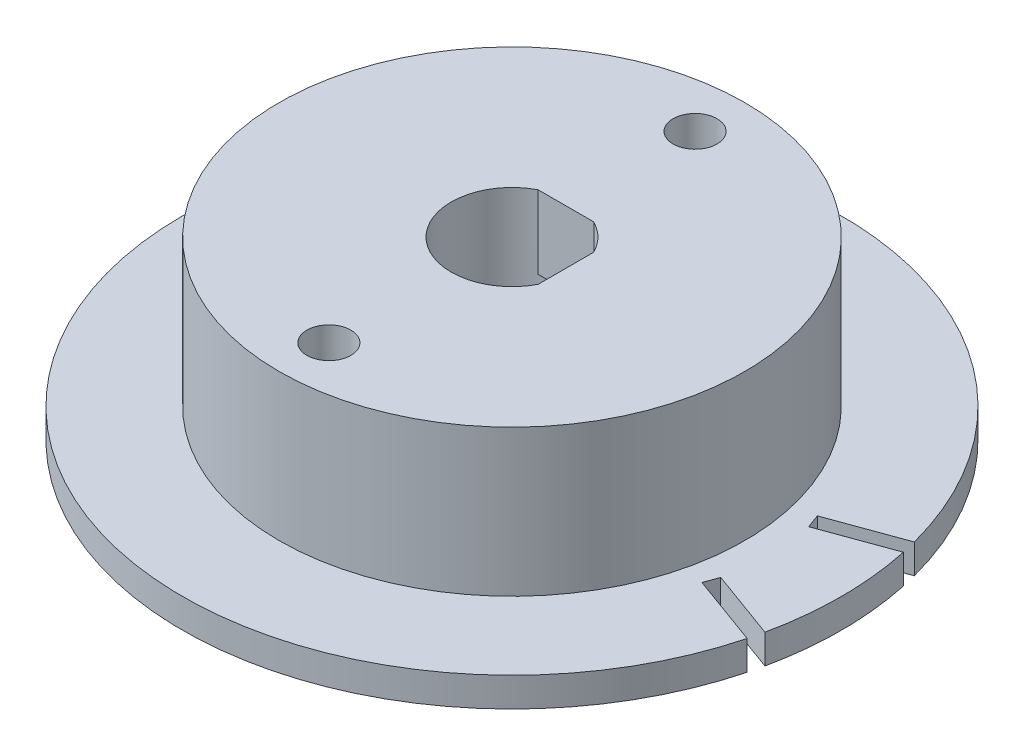
ISO-10303-21;
HEADER;
FILE_DESCRIPTION(('STEP AP214'),'2;1');
FILE_NAME('part.step','',(''),(''),'','','');
FILE_SCHEMA(('AUTOMOTIVE_DESIGN { 1 0 10303 214 1 1 1 1 }'));
ENDSEC;
DATA;
#1=APPLICATION_CONTEXT('core data for automotive mechanical design processes');
#2=APPLICATION_PROTOCOL_DEFINITION('international standard','automotive_design',2000,#1);
#3=PRODUCT_CONTEXT('',#1,'mechanical');
#4=PRODUCT('Part','Part','',(#3));
#5=PRODUCT_RELATED_PRODUCT_CATEGORY('part','',(#4));
#6=PRODUCT_DEFINITION_FORMATION('','',#4);
#7=PRODUCT_DEFINITION_CONTEXT('part definition',#1,'design');
#8=PRODUCT_DEFINITION('design','',#6,#7);
#9=PRODUCT_DEFINITION_SHAPE('','',#8);
#10=(LENGTH_UNIT() NAMED_UNIT(*) SI_UNIT(.MILLI.,.METRE.));
#11=(NAMED_UNIT(*) PLANE_ANGLE_UNIT() SI_UNIT($,.RADIAN.));
#12=(NAMED_UNIT(*) SI_UNIT($,.STERADIAN.) SOLID_ANGLE_UNIT());
#13=UNCERTAINTY_MEASURE_WITH_UNIT(LENGTH_MEASURE(1.E-05),#10,'distance_accuracy_value','');
#14=(GEOMETRIC_REPRESENTATION_CONTEXT(3) GLOBAL_UNCERTAINTY_ASSIGNED_CONTEXT((#13)) GLOBAL_UNIT_ASSIGNED_CONTEXT((#10,
#11,#12)) REPRESENTATION_CONTEXT('',''));
#15=CARTESIAN_POINT('',(0.,0.,0.));
#16=DIRECTION('',(0.,0.,1.));
#17=DIRECTION('',(1.,0.,0.));
#18=AXIS2_PLACEMENT_3D('',#15,#16,#17);
#19=CARTESIAN_POINT('',(0.,-2.,0.));
#20=DIRECTION('',(0.,1.,0.));
#21=DIRECTION('',(0.,0.,1.));
#22=AXIS2_PLACEMENT_3D('',#19,#20,#21);
#23=CYLINDRICAL_SURFACE('',#22,22.5);
#24=CARTESIAN_POINT('',(0.,0.,0.));
#25=DIRECTION('',(0.,-1.,0.));
#26=DIRECTION('',(0.,0.,-1.));
#27=AXIS2_PLACEMENT_3D('',#24,#25,#26);
#28=CIRCLE('',#27,22.5);
#29=CARTESIAN_POINT('',(21.9979445848756,0.,-4.72656683447342));
#30=VERTEX_POINT('',#29);
#31=CARTESIAN_POINT('',(21.9979445848755,0.,4.72656683447342));
#32=VERTEX_POINT('',#31);
#33=EDGE_CURVE('E217',#30,#32,#28,.T.);
#34=ORIENTED_EDGE('',*,*,#33,.T.);
#35=DIRECTION('',(0.,1.,0.));
#36=VECTOR('',#35,1.);
#37=CARTESIAN_POINT('',(21.9979445848755,-3.,4.72656683447342));
#38=LINE('',#37,#36);
#39=CARTESIAN_POINT('',(21.9979445848755,-2.,4.72656683447342));
#40=VERTEX_POINT('',#39);
#41=EDGE_CURVE('E178',#40,#32,#38,.T.);
#42=ORIENTED_EDGE('',*,*,#41,.F.);
#43=CARTESIAN_POINT('',(0.,-2.,0.));
#44=DIRECTION('',(0.,-1.,0.));
#45=DIRECTION('',(0.,0.,-1.));
#46=AXIS2_PLACEMENT_3D('',#43,#44,#45);
#47=CIRCLE('',#46,22.5);
#48=CARTESIAN_POINT('',(21.9979445848756,-2.,-4.72656683447342));
#49=VERTEX_POINT('',#48);
#50=EDGE_CURVE('E212',#49,#40,#47,.T.);
#51=ORIENTED_EDGE('',*,*,#50,.F.);
#52=DIRECTION('',(0.,1.,0.));
#53=VECTOR('',#52,1.);
#54=CARTESIAN_POINT('',(21.9979445848756,-3.,-4.72656683447342));
#55=LINE('',#54,#53);
#56=EDGE_CURVE('E190',#49,#30,#55,.T.);
#57=ORIENTED_EDGE('',*,*,#56,.T.);
#58=EDGE_LOOP('',(#34,#42,#51,#57));
#59=FACE_BOUND('',#58,.T.);
#60=ADVANCED_FACE('F31',(#59),#23,.T.);
#61=CARTESIAN_POINT('',(0.,10.,0.));
#62=DIRECTION('',(0.,-1.,0.));
#63=DIRECTION('',(0.,0.,-1.));
#64=AXIS2_PLACEMENT_3D('',#61,#62,#63);
#65=CYLINDRICAL_SURFACE('',#64,15.9);
#66=CARTESIAN_POINT('',(0.,10.,0.));
#67=DIRECTION('',(0.,1.,0.));
#68=DIRECTION('',(0.,0.,1.));
#69=AXIS2_PLACEMENT_3D('',#66,#67,#68);
#70=CIRCLE('',#69,15.9);
#71=CARTESIAN_POINT('',(0.,10.,15.9));
#72=VERTEX_POINT('',#71);
#73=EDGE_CURVE('E222',#72,#72,#70,.T.);
#74=ORIENTED_EDGE('',*,*,#73,.F.);
#75=EDGE_LOOP('',(#74));
#76=FACE_BOUND('',#75,.T.);
#77=CARTESIAN_POINT('',(0.,0.,0.));
#78=DIRECTION('',(0.,-1.,0.));
#79=DIRECTION('',(0.,0.,-1.));
#80=AXIS2_PLACEMENT_3D('',#77,#78,#79);
#81=CIRCLE('',#80,15.9);
#82=CARTESIAN_POINT('',(0.,0.,-15.9));
#83=VERTEX_POINT('',#82);
#84=EDGE_CURVE('E215',#83,#83,#81,.T.);
#85=ORIENTED_EDGE('',*,*,#84,.F.);
#86=EDGE_LOOP('',(#85));
#87=FACE_BOUND('',#86,.T.);
#88=ADVANCED_FACE('F257',(#76,#87),#65,.T.);
#89=CARTESIAN_POINT('',(0.,10.,0.));
#90=DIRECTION('',(0.,1.,0.));
#91=DIRECTION('',(0.,0.,1.));
#92=AXIS2_PLACEMENT_3D('',#89,#90,#91);
#93=PLANE('',#92);
#94=CARTESIAN_POINT('',(0.,10.,0.));
#95=DIRECTION('',(0.,1.,0.));
#96=DIRECTION('',(0.,0.,1.));
#97=AXIS2_PLACEMENT_3D('',#94,#95,#96);
#98=CIRCLE('',#97,4.15);
#99=CARTESIAN_POINT('',(-1.9,10.,-3.68951216287465));
#100=VERTEX_POINT('',#99);
#101=CARTESIAN_POINT('',(3.68951216287465,10.,1.9));
#102=VERTEX_POINT('',#101);
#103=EDGE_CURVE('E46',#100,#102,#98,.T.);
#104=ORIENTED_EDGE('',*,*,#103,.F.);
#105=DIRECTION('',(-1.,0.,0.));
#106=VECTOR('',#105,1.);
#107=CARTESIAN_POINT('',(1.9,10.,-3.68951216287465));
#108=LINE('',#107,#106);
#109=CARTESIAN_POINT('',(1.9,10.,-3.68951216287465));
#110=VERTEX_POINT('',#109);
#111=EDGE_CURVE('E139',#110,#100,#108,.T.);
#112=ORIENTED_EDGE('',*,*,#111,.F.);
#113=CARTESIAN_POINT('',(0.,10.,0.));
#114=DIRECTION('',(0.,1.,0.));
#115=DIRECTION('',(0.,0.,-1.));
#116=AXIS2_PLACEMENT_3D('',#113,#114,#115);
#117=CIRCLE('',#116,4.15);
#118=CARTESIAN_POINT('',(3.68951216287465,10.,-1.9));
#119=VERTEX_POINT('',#118);
#120=EDGE_CURVE('E167',#119,#110,#117,.T.);
#121=ORIENTED_EDGE('',*,*,#120,.F.);
#122=DIRECTION('',(0.,0.,-1.));
#123=VECTOR('',#122,1.);
#124=CARTESIAN_POINT('',(3.68951216287465,10.,-1.9));
#125=LINE('',#124,#123);
#126=EDGE_CURVE('E164',#102,#119,#125,.T.);
#127=ORIENTED_EDGE('',*,*,#126,.F.);
#128=EDGE_LOOP('',(#104,#112,#121,#127));
#129=FACE_BOUND('',#128,.T.);
#130=CARTESIAN_POINT('',(0.,10.,12.5));
#131=DIRECTION('',(0.,1.,0.));
#132=DIRECTION('',(0.,0.,1.));
#133=AXIS2_PLACEMENT_3D('',#130,#131,#132);
#134=CIRCLE('',#133,1.5);
#135=CARTESIAN_POINT('',(0.,10.,14.));
#136=VERTEX_POINT('',#135);
#137=EDGE_CURVE('E193',#136,#136,#134,.T.);
#138=ORIENTED_EDGE('',*,*,#137,.F.);
#139=EDGE_LOOP('',(#138));
#140=FACE_BOUND('',#139,.T.);
#141=CARTESIAN_POINT('',(0.,10.,-12.5));
#142=DIRECTION('',(0.,1.,0.));
#143=DIRECTION('',(0.,0.,1.));
#144=AXIS2_PLACEMENT_3D('',#141,#142,#143);
#145=CIRCLE('',#144,1.5);
#146=CARTESIAN_POINT('',(0.,10.,-11.));
#147=VERTEX_POINT('',#146);
#148=EDGE_CURVE('E203',#147,#147,#145,.T.);
#149=ORIENTED_EDGE('',*,*,#148,.F.);
#150=EDGE_LOOP('',(#149));
#151=FACE_BOUND('',#150,.T.);
#152=ORIENTED_EDGE('',*,*,#73,.T.);
#153=EDGE_LOOP('',(#152));
#154=FACE_BOUND('',#153,.T.);
#155=ADVANCED_FACE('F264',(#129,#140,#151,#154),#93,.T.);
#156=CARTESIAN_POINT('',(0.,0.,0.));
#157=DIRECTION('',(0.,-1.,0.));
#158=DIRECTION('',(0.,0.,-1.));
#159=AXIS2_PLACEMENT_3D('',#156,#157,#158);
#160=PLANE('',#159);
#161=DIRECTION('',(-0.342020143325669,0.,0.939692620785908));
#162=VECTOR('',#161,1.);
#163=CARTESIAN_POINT('',(16.9122210506549,0.,3.93969262078591));
#164=LINE('',#163,#162);
#165=CARTESIAN_POINT('',(17.2542411939806,0.,3.));
#166=VERTEX_POINT('',#165);
#167=CARTESIAN_POINT('',(16.9122210506549,0.,3.93969262078591));
#168=VERTEX_POINT('',#167);
#169=EDGE_CURVE('E140',#166,#168,#164,.T.);
#170=ORIENTED_EDGE('',*,*,#169,.F.);
#171=DIRECTION('',(-0.939692620785908,0.,-0.342020143325669));
#172=VECTOR('',#171,1.);
#173=CARTESIAN_POINT('',(17.2542411939806,0.,3.));
#174=LINE('',#173,#172);
#175=EDGE_CURVE('E171',#32,#166,#174,.T.);
#176=ORIENTED_EDGE('',*,*,#175,.F.);
#177=ORIENTED_EDGE('',*,*,#33,.F.);
#178=DIRECTION('',(0.939692620785908,0.,-0.342020143325669));
#179=VECTOR('',#178,1.);
#180=CARTESIAN_POINT('',(17.2542411939806,0.,-3.));
#181=LINE('',#180,#179);
#182=CARTESIAN_POINT('',(17.2542411939806,0.,-3.));
#183=VERTEX_POINT('',#182);
#184=EDGE_CURVE('E187',#183,#30,#181,.T.);
#185=ORIENTED_EDGE('',*,*,#184,.F.);
#186=DIRECTION('',(0.342020143325669,0.,0.939692620785908));
#187=VECTOR('',#186,1.);
#188=CARTESIAN_POINT('',(16.9122210506549,0.,-3.93969262078591));
#189=LINE('',#188,#187);
#190=CARTESIAN_POINT('',(16.9122210506549,0.,-3.93969262078591));
#191=VERTEX_POINT('',#190);
#192=EDGE_CURVE('E184',#191,#183,#189,.T.);
#193=ORIENTED_EDGE('',*,*,#192,.F.);
#194=DIRECTION('',(-0.939692620785908,0.,0.342020143325669));
#195=VECTOR('',#194,1.);
#196=CARTESIAN_POINT('',(21.7645134280647,0.,-5.70578261411984));
#197=LINE('',#196,#195);
#198=CARTESIAN_POINT('',(21.7645134280647,0.,-5.70578261411984));
#199=VERTEX_POINT('',#198);
#200=EDGE_CURVE('E177',#199,#191,#197,.T.);
#201=ORIENTED_EDGE('',*,*,#200,.F.);
#202=CARTESIAN_POINT('',(21.7645134280647,0.,5.70578261411984));
#203=VERTEX_POINT('',#202);
#204=EDGE_CURVE('E209',#203,#199,#28,.T.);
#205=ORIENTED_EDGE('',*,*,#204,.F.);
#206=DIRECTION('',(0.939692620785908,0.,0.342020143325669));
#207=VECTOR('',#206,1.);
#208=CARTESIAN_POINT('',(21.7645134280647,0.,5.70578261411984));
#209=LINE('',#208,#207);
#210=EDGE_CURVE('E143',#168,#203,#209,.T.);
#211=ORIENTED_EDGE('',*,*,#210,.F.);
#212=EDGE_LOOP('',(#170,#176,#177,#185,#193,#201,#205,#211));
#213=FACE_BOUND('',#212,.T.);
#214=ORIENTED_EDGE('',*,*,#84,.T.);
#215=EDGE_LOOP('',(#214));
#216=FACE_BOUND('',#215,.T.);
#217=ADVANCED_FACE('F270',(#213,#216),#160,.F.);
#218=CARTESIAN_POINT('',(21.7645134280647,-2.,5.70578261411984));
#219=VERTEX_POINT('',#218);
#220=CARTESIAN_POINT('',(21.7645134280647,-2.,-5.70578261411984));
#221=VERTEX_POINT('',#220);
#222=EDGE_CURVE('E216',#219,#221,#47,.T.);
#223=ORIENTED_EDGE('',*,*,#222,.F.);
#224=DIRECTION('',(0.,1.,0.));
#225=VECTOR('',#224,1.);
#226=CARTESIAN_POINT('',(21.7645134280647,-3.,5.70578261411984));
#227=LINE('',#226,#225);
#228=EDGE_CURVE('E54',#219,#203,#227,.T.);
#229=ORIENTED_EDGE('',*,*,#228,.T.);
#230=ORIENTED_EDGE('',*,*,#204,.T.);
#231=DIRECTION('',(0.,1.,0.));
#232=VECTOR('',#231,1.);
#233=CARTESIAN_POINT('',(21.7645134280647,-3.,-5.70578261411984));
#234=LINE('',#233,#232);
#235=EDGE_CURVE('E189',#221,#199,#234,.T.);
#236=ORIENTED_EDGE('',*,*,#235,.F.);
#237=EDGE_LOOP('',(#223,#229,#230,#236));
#238=FACE_BOUND('',#237,.T.);
#239=ADVANCED_FACE('F260',(#238),#23,.T.);
#240=CARTESIAN_POINT('',(0.,-2.,0.));
#241=DIRECTION('',(0.,-1.,0.));
#242=DIRECTION('',(0.,0.,-1.));
#243=AXIS2_PLACEMENT_3D('',#240,#241,#242);
#244=PLANE('',#243);
#245=CARTESIAN_POINT('',(0.,-2.,0.));
#246=DIRECTION('',(0.,-1.,0.));
#247=DIRECTION('',(0.,0.,-1.));
#248=AXIS2_PLACEMENT_3D('',#245,#246,#247);
#249=CIRCLE('',#248,5.15000000000002);
#250=CARTESIAN_POINT('',(0.,-2.,-5.15000000000002));
#251=VERTEX_POINT('',#250);
#252=EDGE_CURVE('E11',#251,#251,#249,.F.);
#253=ORIENTED_EDGE('',*,*,#252,.T.);
#254=EDGE_LOOP('',(#253));
#255=FACE_BOUND('',#254,.T.);
#256=DIRECTION('',(0.939692620785908,0.,0.342020143325669));
#257=VECTOR('',#256,1.);
#258=CARTESIAN_POINT('',(1.0541813890188,-2.,-2.89633956233845));
#259=LINE('',#258,#257);
#260=CARTESIAN_POINT('',(17.2542411939806,-2.,3.));
#261=VERTEX_POINT('',#260);
#262=EDGE_CURVE('E237',#261,#40,#259,.T.);
#263=ORIENTED_EDGE('',*,*,#262,.F.);
#264=DIRECTION('',(0.342020143325669,0.,-0.939692620785908));
#265=VECTOR('',#264,1.);
#266=CARTESIAN_POINT('',(16.2000598049618,-2.,5.89633956233845));
#267=LINE('',#266,#265);
#268=CARTESIAN_POINT('',(16.9122210506549,-2.,3.93969262078591));
#269=VERTEX_POINT('',#268);
#270=EDGE_CURVE('E235',#269,#261,#267,.T.);
#271=ORIENTED_EDGE('',*,*,#270,.F.);
#272=DIRECTION('',(-0.939692620785908,0.,-0.342020143325669));
#273=VECTOR('',#272,1.);
#274=CARTESIAN_POINT('',(0.712161245693128,-2.,-1.95664694155254));
#275=LINE('',#274,#273);
#276=EDGE_CURVE('E233',#219,#269,#275,.T.);
#277=ORIENTED_EDGE('',*,*,#276,.F.);
#278=ORIENTED_EDGE('',*,*,#222,.T.);
#279=DIRECTION('',(0.939692620785908,0.,-0.342020143325669));
#280=VECTOR('',#279,1.);
#281=CARTESIAN_POINT('',(0.71216124569313,-2.,1.95664694155254));
#282=LINE('',#281,#280);
#283=CARTESIAN_POINT('',(16.9122210506549,-2.,-3.93969262078591));
#284=VERTEX_POINT('',#283);
#285=EDGE_CURVE('E225',#284,#221,#282,.T.);
#286=ORIENTED_EDGE('',*,*,#285,.F.);
#287=DIRECTION('',(-0.342020143325669,0.,-0.939692620785908));
#288=VECTOR('',#287,1.);
#289=CARTESIAN_POINT('',(16.2000598049618,-2.,-5.89633956233845));
#290=LINE('',#289,#288);
#291=CARTESIAN_POINT('',(17.2542411939806,-2.,-3.));
#292=VERTEX_POINT('',#291);
#293=EDGE_CURVE('E228',#292,#284,#290,.T.);
#294=ORIENTED_EDGE('',*,*,#293,.F.);
#295=DIRECTION('',(-0.939692620785908,0.,0.342020143325669));
#296=VECTOR('',#295,1.);
#297=CARTESIAN_POINT('',(1.0541813890188,-2.,2.89633956233845));
#298=LINE('',#297,#296);
#299=EDGE_CURVE('E231',#49,#292,#298,.T.);
#300=ORIENTED_EDGE('',*,*,#299,.F.);
#301=ORIENTED_EDGE('',*,*,#50,.T.);
#302=EDGE_LOOP('',(#263,#271,#277,#278,#286,#294,#300,#301));
#303=FACE_BOUND('',#302,.T.);
#304=ADVANCED_FACE('F269',(#255,#303),#244,.T.);
#305=CARTESIAN_POINT('',(0.,7.,-12.5));
#306=DIRECTION('',(0.,1.,0.));
#307=DIRECTION('',(0.,0.,1.));
#308=AXIS2_PLACEMENT_3D('',#305,#306,#307);
#309=CYLINDRICAL_SURFACE('',#308,1.5);
#310=CARTESIAN_POINT('',(0.,7.,-12.5));
#311=DIRECTION('',(0.,1.,0.));
#312=DIRECTION('',(0.,0.,1.));
#313=AXIS2_PLACEMENT_3D('',#310,#311,#312);
#314=CIRCLE('',#313,1.5);
#315=CARTESIAN_POINT('',(0.,7.,-11.));
#316=VERTEX_POINT('',#315);
#317=EDGE_CURVE('E206',#316,#316,#314,.T.);
#318=ORIENTED_EDGE('',*,*,#317,.F.);
#319=EDGE_LOOP('',(#318));
#320=FACE_BOUND('',#319,.T.);
#321=ORIENTED_EDGE('',*,*,#148,.T.);
#322=EDGE_LOOP('',(#321));
#323=FACE_BOUND('',#322,.T.);
#324=ADVANCED_FACE('F276',(#320,#323),#309,.F.);
#325=CARTESIAN_POINT('',(0.,7.,-12.5));
#326=DIRECTION('',(0.,1.,0.));
#327=DIRECTION('',(0.,0.,1.));
#328=AXIS2_PLACEMENT_3D('',#325,#326,#327);
#329=PLANE('',#328);
#330=ORIENTED_EDGE('',*,*,#317,.T.);
#331=EDGE_LOOP('',(#330));
#332=FACE_BOUND('',#331,.T.);
#333=ADVANCED_FACE('F333',(#332),#329,.T.);
#334=CARTESIAN_POINT('',(0.,7.,12.5));
#335=DIRECTION('',(0.,1.,0.));
#336=DIRECTION('',(0.,0.,1.));
#337=AXIS2_PLACEMENT_3D('',#334,#335,#336);
#338=CYLINDRICAL_SURFACE('',#337,1.5);
#339=CARTESIAN_POINT('',(0.,7.,12.5));
#340=DIRECTION('',(0.,1.,0.));
#341=DIRECTION('',(0.,0.,1.));
#342=AXIS2_PLACEMENT_3D('',#339,#340,#341);
#343=CIRCLE('',#342,1.5);
#344=CARTESIAN_POINT('',(0.,7.,14.));
#345=VERTEX_POINT('',#344);
#346=EDGE_CURVE('E200',#345,#345,#343,.T.);
#347=ORIENTED_EDGE('',*,*,#346,.F.);
#348=EDGE_LOOP('',(#347));
#349=FACE_BOUND('',#348,.T.);
#350=ORIENTED_EDGE('',*,*,#137,.T.);
#351=EDGE_LOOP('',(#350));
#352=FACE_BOUND('',#351,.T.);
#353=ADVANCED_FACE('F329',(#349,#352),#338,.F.);
#354=CARTESIAN_POINT('',(0.,7.,12.5));
#355=DIRECTION('',(0.,1.,0.));
#356=DIRECTION('',(0.,0.,1.));
#357=AXIS2_PLACEMENT_3D('',#354,#355,#356);
#358=PLANE('',#357);
#359=ORIENTED_EDGE('',*,*,#346,.T.);
#360=EDGE_LOOP('',(#359));
#361=FACE_BOUND('',#360,.T.);
#362=ADVANCED_FACE('F322',(#361),#358,.T.);
#363=CARTESIAN_POINT('',(17.2542411939806,-3.,-3.));
#364=DIRECTION('',(0.342020143325669,0.,0.939692620785908));
#365=DIRECTION('',(0.939692620785908,0.,-0.342020143325669));
#366=AXIS2_PLACEMENT_3D('',#363,#364,#365);
#367=PLANE('',#366);
#368=ORIENTED_EDGE('',*,*,#299,.T.);
#369=DIRECTION('',(0.,1.,0.));
#370=VECTOR('',#369,1.);
#371=CARTESIAN_POINT('',(17.2542411939806,-3.,-3.));
#372=LINE('',#371,#370);
#373=EDGE_CURVE('E194',#292,#183,#372,.T.);
#374=ORIENTED_EDGE('',*,*,#373,.T.);
#375=ORIENTED_EDGE('',*,*,#184,.T.);
#376=ORIENTED_EDGE('',*,*,#56,.F.);
#377=EDGE_LOOP('',(#368,#374,#375,#376));
#378=FACE_BOUND('',#377,.T.);
#379=ADVANCED_FACE('F319',(#378),#367,.F.);
#380=CARTESIAN_POINT('',(16.9122210506549,-3.,-3.93969262078591));
#381=DIRECTION('',(-0.939692620785908,0.,0.342020143325669));
#382=DIRECTION('',(0.342020143325669,0.,0.939692620785908));
#383=AXIS2_PLACEMENT_3D('',#380,#381,#382);
#384=PLANE('',#383);
#385=ORIENTED_EDGE('',*,*,#293,.T.);
#386=DIRECTION('',(0.,1.,0.));
#387=VECTOR('',#386,1.);
#388=CARTESIAN_POINT('',(16.9122210506549,-3.,-3.93969262078591));
#389=LINE('',#388,#387);
#390=EDGE_CURVE('E196',#284,#191,#389,.T.);
#391=ORIENTED_EDGE('',*,*,#390,.T.);
#392=ORIENTED_EDGE('',*,*,#192,.T.);
#393=ORIENTED_EDGE('',*,*,#373,.F.);
#394=EDGE_LOOP('',(#385,#391,#392,#393));
#395=FACE_BOUND('',#394,.T.);
#396=ADVANCED_FACE('F293',(#395),#384,.F.);
#397=CARTESIAN_POINT('',(21.7645134280647,-3.,-5.70578261411984));
#398=DIRECTION('',(-0.342020143325669,0.,-0.939692620785908));
#399=DIRECTION('',(-0.939692620785908,0.,0.342020143325669));
#400=AXIS2_PLACEMENT_3D('',#397,#398,#399);
#401=PLANE('',#400);
#402=ORIENTED_EDGE('',*,*,#285,.T.);
#403=ORIENTED_EDGE('',*,*,#235,.T.);
#404=ORIENTED_EDGE('',*,*,#200,.T.);
#405=ORIENTED_EDGE('',*,*,#390,.F.);
#406=EDGE_LOOP('',(#402,#403,#404,#405));
#407=FACE_BOUND('',#406,.T.);
#408=ADVANCED_FACE('F288',(#407),#401,.F.);
#409=CARTESIAN_POINT('',(16.9122210506549,-3.,3.93969262078591));
#410=DIRECTION('',(-0.939692620785908,0.,-0.342020143325669));
#411=DIRECTION('',(-0.342020143325669,0.,0.939692620785908));
#412=AXIS2_PLACEMENT_3D('',#409,#410,#411);
#413=PLANE('',#412);
#414=ORIENTED_EDGE('',*,*,#270,.T.);
#415=DIRECTION('',(0.,1.,0.));
#416=VECTOR('',#415,1.);
#417=CARTESIAN_POINT('',(17.2542411939806,-3.,3.));
#418=LINE('',#417,#416);
#419=EDGE_CURVE('E175',#261,#166,#418,.T.);
#420=ORIENTED_EDGE('',*,*,#419,.T.);
#421=ORIENTED_EDGE('',*,*,#169,.T.);
#422=DIRECTION('',(0.,1.,0.));
#423=VECTOR('',#422,1.);
#424=CARTESIAN_POINT('',(16.9122210506549,-3.,3.93969262078591));
#425=LINE('',#424,#423);
#426=EDGE_CURVE('E174',#269,#168,#425,.T.);
#427=ORIENTED_EDGE('',*,*,#426,.F.);
#428=EDGE_LOOP('',(#414,#420,#421,#427));
#429=FACE_BOUND('',#428,.T.);
#430=ADVANCED_FACE('F306',(#429),#413,.F.);
#431=CARTESIAN_POINT('',(17.2542411939806,-3.,3.));
#432=DIRECTION('',(0.342020143325669,0.,-0.939692620785908));
#433=DIRECTION('',(-0.939692620785908,0.,-0.342020143325669));
#434=AXIS2_PLACEMENT_3D('',#431,#432,#433);
#435=PLANE('',#434);
#436=ORIENTED_EDGE('',*,*,#262,.T.);
#437=ORIENTED_EDGE('',*,*,#41,.T.);
#438=ORIENTED_EDGE('',*,*,#175,.T.);
#439=ORIENTED_EDGE('',*,*,#419,.F.);
#440=EDGE_LOOP('',(#436,#437,#438,#439));
#441=FACE_BOUND('',#440,.T.);
#442=ADVANCED_FACE('F299',(#441),#435,.F.);
#443=CARTESIAN_POINT('',(21.7645134280647,-3.,5.70578261411984));
#444=DIRECTION('',(-0.342020143325669,0.,0.939692620785908));
#445=DIRECTION('',(0.939692620785908,0.,0.342020143325669));
#446=AXIS2_PLACEMENT_3D('',#443,#444,#445);
#447=PLANE('',#446);
#448=ORIENTED_EDGE('',*,*,#276,.T.);
#449=ORIENTED_EDGE('',*,*,#426,.T.);
#450=ORIENTED_EDGE('',*,*,#210,.T.);
#451=ORIENTED_EDGE('',*,*,#228,.F.);
#452=EDGE_LOOP('',(#448,#449,#450,#451));
#453=FACE_BOUND('',#452,.T.);
#454=ADVANCED_FACE('F307',(#453),#447,.F.);
#455=CARTESIAN_POINT('',(0.,5.,0.));
#456=DIRECTION('',(0.,1.,0.));
#457=DIRECTION('',(0.,0.,1.));
#458=AXIS2_PLACEMENT_3D('',#455,#456,#457);
#459=CYLINDRICAL_SURFACE('',#458,4.15);
#460=CARTESIAN_POINT('',(0.,-0.999999999999977,0.));
#461=DIRECTION('',(0.,-1.,0.));
#462=DIRECTION('',(0.,0.,-1.));
#463=AXIS2_PLACEMENT_3D('',#460,#461,#462);
#464=CIRCLE('',#463,4.15);
#465=CARTESIAN_POINT('',(0.,-0.999999999999977,-4.15));
#466=VERTEX_POINT('',#465);
#467=EDGE_CURVE('E39',#466,#466,#464,.T.);
#468=ORIENTED_EDGE('',*,*,#467,.T.);
#469=EDGE_LOOP('',(#468));
#470=FACE_BOUND('',#469,.T.);
#471=ORIENTED_EDGE('',*,*,#103,.T.);
#472=DIRECTION('',(0.,1.,0.));
#473=VECTOR('',#472,1.);
#474=CARTESIAN_POINT('',(3.68951216287465,5.,1.9));
#475=LINE('',#474,#473);
#476=CARTESIAN_POINT('',(3.68951216287465,5.,1.9));
#477=VERTEX_POINT('',#476);
#478=EDGE_CURVE('E127',#477,#102,#475,.T.);
#479=ORIENTED_EDGE('',*,*,#478,.F.);
#480=CARTESIAN_POINT('',(0.,5.,0.));
#481=DIRECTION('',(0.,1.,0.));
#482=DIRECTION('',(0.,0.,1.));
#483=AXIS2_PLACEMENT_3D('',#480,#481,#482);
#484=CIRCLE('',#483,4.15);
#485=CARTESIAN_POINT('',(3.68951216287465,5.,-1.9));
#486=VERTEX_POINT('',#485);
#487=EDGE_CURVE('E135',#486,#477,#484,.F.);
#488=ORIENTED_EDGE('',*,*,#487,.F.);
#489=DIRECTION('',(0.,1.,0.));
#490=VECTOR('',#489,1.);
#491=CARTESIAN_POINT('',(3.68951216287465,5.,-1.9));
#492=LINE('',#491,#490);
#493=EDGE_CURVE('E145',#486,#119,#492,.T.);
#494=ORIENTED_EDGE('',*,*,#493,.T.);
#495=ORIENTED_EDGE('',*,*,#120,.T.);
#496=DIRECTION('',(0.,1.,0.));
#497=VECTOR('',#496,1.);
#498=CARTESIAN_POINT('',(1.9,5.,-3.68951216287465));
#499=LINE('',#498,#497);
#500=CARTESIAN_POINT('',(1.9,5.,-3.68951216287465));
#501=VERTEX_POINT('',#500);
#502=EDGE_CURVE('E134',#501,#110,#499,.T.);
#503=ORIENTED_EDGE('',*,*,#502,.F.);
#504=CARTESIAN_POINT('',(-1.9,5.,-3.68951216287465));
#505=VERTEX_POINT('',#504);
#506=EDGE_CURVE('E123',#505,#501,#484,.F.);
#507=ORIENTED_EDGE('',*,*,#506,.F.);
#508=DIRECTION('',(0.,1.,0.));
#509=VECTOR('',#508,1.);
#510=CARTESIAN_POINT('',(-1.9,5.,-3.68951216287465));
#511=LINE('',#510,#509);
#512=EDGE_CURVE('E131',#505,#100,#511,.T.);
#513=ORIENTED_EDGE('',*,*,#512,.T.);
#514=EDGE_LOOP('',(#471,#479,#488,#494,#495,#503,#507,#513));
#515=FACE_BOUND('',#514,.T.);
#516=ADVANCED_FACE('F130',(#470,#515),#459,.F.);
#517=CARTESIAN_POINT('',(1.9,5.,-3.68951216287465));
#518=DIRECTION('',(0.,0.,-1.));
#519=DIRECTION('',(-1.,0.,0.));
#520=AXIS2_PLACEMENT_3D('',#517,#518,#519);
#521=PLANE('',#520);
#522=ORIENTED_EDGE('',*,*,#111,.T.);
#523=ORIENTED_EDGE('',*,*,#512,.F.);
#524=DIRECTION('',(-1.,0.,0.));
#525=VECTOR('',#524,1.);
#526=CARTESIAN_POINT('',(1.9,5.,-3.68951216287465));
#527=LINE('',#526,#525);
#528=EDGE_CURVE('E120',#501,#505,#527,.T.);
#529=ORIENTED_EDGE('',*,*,#528,.F.);
#530=ORIENTED_EDGE('',*,*,#502,.T.);
#531=EDGE_LOOP('',(#522,#523,#529,#530));
#532=FACE_BOUND('',#531,.T.);
#533=ADVANCED_FACE('F137',(#532),#521,.F.);
#534=CARTESIAN_POINT('',(3.68951216287465,5.,-1.9));
#535=DIRECTION('',(1.,0.,0.));
#536=DIRECTION('',(0.,0.,-1.));
#537=AXIS2_PLACEMENT_3D('',#534,#535,#536);
#538=PLANE('',#537);
#539=ORIENTED_EDGE('',*,*,#126,.T.);
#540=ORIENTED_EDGE('',*,*,#493,.F.);
#541=DIRECTION('',(0.,0.,-1.));
#542=VECTOR('',#541,1.);
#543=CARTESIAN_POINT('',(3.68951216287465,5.,-1.9));
#544=LINE('',#543,#542);
#545=EDGE_CURVE('E128',#477,#486,#544,.T.);
#546=ORIENTED_EDGE('',*,*,#545,.F.);
#547=ORIENTED_EDGE('',*,*,#478,.T.);
#548=EDGE_LOOP('',(#539,#540,#546,#547));
#549=FACE_BOUND('',#548,.T.);
#550=ADVANCED_FACE('F361',(#549),#538,.F.);
#551=CARTESIAN_POINT('',(0.,5.,0.));
#552=DIRECTION('',(0.,1.,0.));
#553=DIRECTION('',(0.,0.,1.));
#554=AXIS2_PLACEMENT_3D('',#551,#552,#553);
#555=PLANE('',#554);
#556=ORIENTED_EDGE('',*,*,#545,.T.);
#557=ORIENTED_EDGE('',*,*,#487,.T.);
#558=EDGE_LOOP('',(#556,#557));
#559=FACE_BOUND('',#558,.T.);
#560=ADVANCED_FACE('F253',(#559),#555,.F.);
#561=ORIENTED_EDGE('',*,*,#528,.T.);
#562=ORIENTED_EDGE('',*,*,#506,.T.);
#563=EDGE_LOOP('',(#561,#562));
#564=FACE_BOUND('',#563,.T.);
#565=ADVANCED_FACE('F122',(#564),#555,.F.);
#566=CARTESIAN_POINT('',(0.,-0.999999999999977,0.));
#567=DIRECTION('',(0.,-1.,0.));
#568=DIRECTION('',(0.,0.,-1.));
#569=AXIS2_PLACEMENT_3D('',#566,#567,#568);
#570=CONICAL_SURFACE('',#569,4.15,0.785398163397448);
#571=ORIENTED_EDGE('',*,*,#252,.F.);
#572=EDGE_LOOP('',(#571));
#573=FACE_BOUND('',#572,.T.);
#574=ORIENTED_EDGE('',*,*,#467,.F.);
#575=EDGE_LOOP('',(#574));
#576=FACE_BOUND('',#575,.T.);
#577=ADVANCED_FACE('F33',(#573,#576),#570,.F.);
#578=CLOSED_SHELL('',(#60,#88,#155,#217,#239,#304,#324,#333,#353,#362,#379,#396,#408,#430,#442,
#454,#516,#533,#550,#560,#565,#577));
#579=MANIFOLD_SOLID_BREP('B2',#578);
#580=ADVANCED_BREP_SHAPE_REPRESENTATION('',(#18,#579),#14);
#581=SHAPE_DEFINITION_REPRESENTATION(#9,#580);
ENDSEC;
END-ISO-10303-21;
